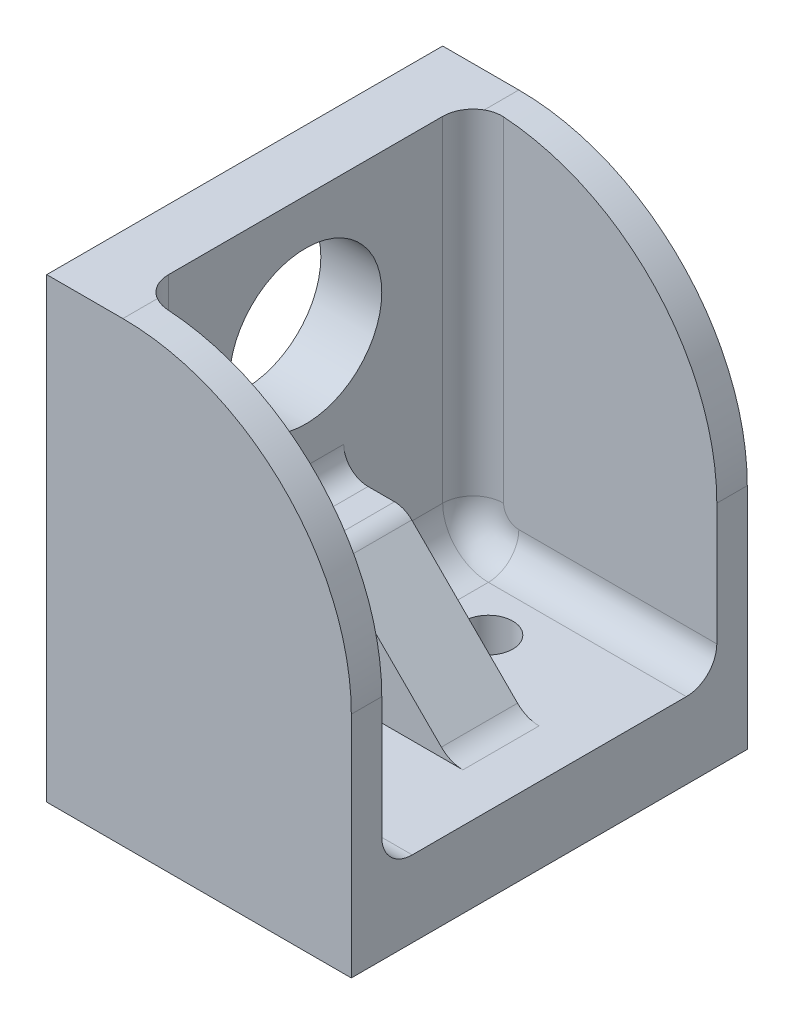
ISO-10303-21;
HEADER;
FILE_DESCRIPTION(('STEP AP214'),'2;1');
FILE_NAME('part.step','',(''),(''),'','','');
FILE_SCHEMA(('AUTOMOTIVE_DESIGN { 1 0 10303 214 1 1 1 1 }'));
ENDSEC;
DATA;
#1=APPLICATION_CONTEXT('core data for automotive mechanical design processes');
#2=APPLICATION_PROTOCOL_DEFINITION('international standard','automotive_design',2000,#1);
#3=PRODUCT_CONTEXT('',#1,'mechanical');
#4=PRODUCT('Part','Part','',(#3));
#5=PRODUCT_RELATED_PRODUCT_CATEGORY('part','',(#4));
#6=PRODUCT_DEFINITION_FORMATION('','',#4);
#7=PRODUCT_DEFINITION_CONTEXT('part definition',#1,'design');
#8=PRODUCT_DEFINITION('design','',#6,#7);
#9=PRODUCT_DEFINITION_SHAPE('','',#8);
#10=(LENGTH_UNIT() NAMED_UNIT(*) SI_UNIT(.MILLI.,.METRE.));
#11=(NAMED_UNIT(*) PLANE_ANGLE_UNIT() SI_UNIT($,.RADIAN.));
#12=(NAMED_UNIT(*) SI_UNIT($,.STERADIAN.) SOLID_ANGLE_UNIT());
#13=UNCERTAINTY_MEASURE_WITH_UNIT(LENGTH_MEASURE(1.E-05),#10,'distance_accuracy_value','');
#14=(GEOMETRIC_REPRESENTATION_CONTEXT(3) GLOBAL_UNCERTAINTY_ASSIGNED_CONTEXT((#13)) GLOBAL_UNIT_ASSIGNED_CONTEXT((#10,
#11,#12)) REPRESENTATION_CONTEXT('',''));
#15=CARTESIAN_POINT('',(0.,0.,0.));
#16=DIRECTION('',(0.,0.,1.));
#17=DIRECTION('',(1.,0.,0.));
#18=AXIS2_PLACEMENT_3D('',#15,#16,#17);
#19=CARTESIAN_POINT('',(0.,5.,0.));
#20=DIRECTION('',(0.,1.,0.));
#21=DIRECTION('',(0.,0.,1.));
#22=AXIS2_PLACEMENT_3D('',#19,#20,#21);
#23=PLANE('',#22);
#24=CARTESIAN_POINT('',(10.,5.,6.));
#25=DIRECTION('',(0.,1.,0.));
#26=DIRECTION('',(0.,0.,1.));
#27=AXIS2_PLACEMENT_3D('',#24,#25,#26);
#28=CIRCLE('',#27,1.6);
#29=CARTESIAN_POINT('',(10.,5.,7.6));
#30=VERTEX_POINT('',#29);
#31=EDGE_CURVE('E571',#30,#30,#28,.T.);
#32=ORIENTED_EDGE('',*,*,#31,.F.);
#33=EDGE_LOOP('',(#32));
#34=FACE_BOUND('',#33,.T.);
#35=CARTESIAN_POINT('',(10.,5.,-6.));
#36=DIRECTION('',(0.,1.,0.));
#37=DIRECTION('',(0.,0.,1.));
#38=AXIS2_PLACEMENT_3D('',#35,#36,#37);
#39=CIRCLE('',#38,1.6);
#40=CARTESIAN_POINT('',(10.,5.,-4.4));
#41=VERTEX_POINT('',#40);
#42=EDGE_CURVE('E568',#41,#41,#39,.T.);
#43=ORIENTED_EDGE('',*,*,#42,.F.);
#44=EDGE_LOOP('',(#43));
#45=FACE_BOUND('',#44,.T.);
#46=DIRECTION('',(0.,0.,-1.));
#47=VECTOR('',#46,1.);
#48=CARTESIAN_POINT('',(7.,5.,13.));
#49=LINE('',#48,#47);
#50=CARTESIAN_POINT('',(7.,5.,2.5));
#51=VERTEX_POINT('',#50);
#52=CARTESIAN_POINT('',(7.,5.,9.));
#53=VERTEX_POINT('',#52);
#54=EDGE_CURVE('E281',#51,#53,#49,.F.);
#55=ORIENTED_EDGE('',*,*,#54,.T.);
#56=DIRECTION('',(-1.,0.,0.));
#57=VECTOR('',#56,1.);
#58=CARTESIAN_POINT('',(0.,5.,9.));
#59=LINE('',#58,#57);
#60=CARTESIAN_POINT('',(20.,5.,9.));
#61=VERTEX_POINT('',#60);
#62=EDGE_CURVE('E334',#53,#61,#59,.F.);
#63=ORIENTED_EDGE('',*,*,#62,.T.);
#64=DIRECTION('',(0.,0.,-1.));
#65=VECTOR('',#64,1.);
#66=CARTESIAN_POINT('',(20.,5.,13.));
#67=LINE('',#66,#65);
#68=CARTESIAN_POINT('',(20.,5.,-8.99999999999999));
#69=VERTEX_POINT('',#68);
#70=EDGE_CURVE('E575',#61,#69,#67,.T.);
#71=ORIENTED_EDGE('',*,*,#70,.T.);
#72=DIRECTION('',(1.,0.,0.));
#73=VECTOR('',#72,1.);
#74=CARTESIAN_POINT('',(0.,5.,-9.));
#75=LINE('',#74,#73);
#76=CARTESIAN_POINT('',(7.,5.,-9.));
#77=VERTEX_POINT('',#76);
#78=EDGE_CURVE('E331',#69,#77,#75,.F.);
#79=ORIENTED_EDGE('',*,*,#78,.T.);
#80=DIRECTION('',(0.,0.,-1.));
#81=VECTOR('',#80,1.);
#82=CARTESIAN_POINT('',(7.,5.,-2.5));
#83=LINE('',#82,#81);
#84=CARTESIAN_POINT('',(7.,5.,-2.5));
#85=VERTEX_POINT('',#84);
#86=EDGE_CURVE('E285',#77,#85,#83,.F.);
#87=ORIENTED_EDGE('',*,*,#86,.T.);
#88=DIRECTION('',(-1.,0.,0.));
#89=VECTOR('',#88,1.);
#90=CARTESIAN_POINT('',(4.,5.,-2.5));
#91=LINE('',#90,#89);
#92=CARTESIAN_POINT('',(16.8284271247461,5.,-2.5));
#93=VERTEX_POINT('',#92);
#94=EDGE_CURVE('E639',#93,#85,#91,.T.);
#95=ORIENTED_EDGE('',*,*,#94,.F.);
#96=DIRECTION('',(0.,0.,1.));
#97=VECTOR('',#96,1.);
#98=CARTESIAN_POINT('',(16.8284271247461,5.,2.5));
#99=LINE('',#98,#97);
#100=CARTESIAN_POINT('',(16.8284271247461,5.,2.5));
#101=VERTEX_POINT('',#100);
#102=EDGE_CURVE('E327',#93,#101,#99,.T.);
#103=ORIENTED_EDGE('',*,*,#102,.T.);
#104=DIRECTION('',(1.,0.,0.));
#105=VECTOR('',#104,1.);
#106=CARTESIAN_POINT('',(4.,5.,2.5));
#107=LINE('',#106,#105);
#108=EDGE_CURVE('E643',#51,#101,#107,.T.);
#109=ORIENTED_EDGE('',*,*,#108,.F.);
#110=EDGE_LOOP('',(#55,#63,#71,#79,#87,#95,#103,#109));
#111=FACE_BOUND('',#110,.T.);
#112=ADVANCED_FACE('F53',(#34,#45,#111),#23,.T.);
#113=CARTESIAN_POINT('',(4.,0.,0.));
#114=DIRECTION('',(1.,0.,0.));
#115=DIRECTION('',(0.,0.,-1.));
#116=AXIS2_PLACEMENT_3D('',#113,#114,#115);
#117=PLANE('',#116);
#118=CARTESIAN_POINT('',(4.,22.,0.));
#119=DIRECTION('',(1.,0.,0.));
#120=DIRECTION('',(0.,0.,-1.));
#121=AXIS2_PLACEMENT_3D('',#118,#119,#120);
#122=CIRCLE('',#121,5.);
#123=CARTESIAN_POINT('',(4.,22.,-5.));
#124=VERTEX_POINT('',#123);
#125=EDGE_CURVE('E554',#124,#124,#122,.T.);
#126=ORIENTED_EDGE('',*,*,#125,.F.);
#127=EDGE_LOOP('',(#126));
#128=FACE_BOUND('',#127,.T.);
#129=DIRECTION('',(0.,-1.,0.));
#130=VECTOR('',#129,1.);
#131=CARTESIAN_POINT('',(4.,13.,2.5));
#132=LINE('',#131,#130);
#133=CARTESIAN_POINT('',(4.,14.6,2.5));
#134=VERTEX_POINT('',#133);
#135=CARTESIAN_POINT('',(4.,8.,2.5));
#136=VERTEX_POINT('',#135);
#137=EDGE_CURVE('E544',#134,#136,#132,.T.);
#138=ORIENTED_EDGE('',*,*,#137,.F.);
#139=DIRECTION('',(0.,0.,1.));
#140=VECTOR('',#139,1.);
#141=CARTESIAN_POINT('',(4.,14.6,-2.5));
#142=LINE('',#141,#140);
#143=CARTESIAN_POINT('',(4.,14.6,-2.5));
#144=VERTEX_POINT('',#143);
#145=EDGE_CURVE('E527',#134,#144,#142,.F.);
#146=ORIENTED_EDGE('',*,*,#145,.T.);
#147=DIRECTION('',(0.,-1.,0.));
#148=VECTOR('',#147,1.);
#149=CARTESIAN_POINT('',(4.,13.,-2.5));
#150=LINE('',#149,#148);
#151=CARTESIAN_POINT('',(4.,8.,-2.5));
#152=VERTEX_POINT('',#151);
#153=EDGE_CURVE('E550',#144,#152,#150,.T.);
#154=ORIENTED_EDGE('',*,*,#153,.T.);
#155=DIRECTION('',(0.,0.,-1.));
#156=VECTOR('',#155,1.);
#157=CARTESIAN_POINT('',(4.,8.,-13.));
#158=LINE('',#157,#156);
#159=CARTESIAN_POINT('',(4.,8.,-9.));
#160=VERTEX_POINT('',#159);
#161=EDGE_CURVE('E277',#152,#160,#158,.T.);
#162=ORIENTED_EDGE('',*,*,#161,.T.);
#163=DIRECTION('',(0.,-1.,0.));
#164=VECTOR('',#163,1.);
#165=CARTESIAN_POINT('',(4.,0.,-9.));
#166=LINE('',#165,#164);
#167=CARTESIAN_POINT('',(4.,30.,-9.));
#168=VERTEX_POINT('',#167);
#169=EDGE_CURVE('E357',#160,#168,#166,.F.);
#170=ORIENTED_EDGE('',*,*,#169,.T.);
#171=DIRECTION('',(0.,0.,1.));
#172=VECTOR('',#171,1.);
#173=CARTESIAN_POINT('',(4.,30.,-13.));
#174=LINE('',#173,#172);
#175=CARTESIAN_POINT('',(4.,30.,8.99999999999999));
#176=VERTEX_POINT('',#175);
#177=EDGE_CURVE('E559',#168,#176,#174,.T.);
#178=ORIENTED_EDGE('',*,*,#177,.T.);
#179=DIRECTION('',(0.,-1.,0.));
#180=VECTOR('',#179,1.);
#181=CARTESIAN_POINT('',(4.,0.,9.));
#182=LINE('',#181,#180);
#183=CARTESIAN_POINT('',(4.,8.,9.));
#184=VERTEX_POINT('',#183);
#185=EDGE_CURVE('E360',#176,#184,#182,.T.);
#186=ORIENTED_EDGE('',*,*,#185,.T.);
#187=DIRECTION('',(0.,0.,-1.));
#188=VECTOR('',#187,1.);
#189=CARTESIAN_POINT('',(4.,8.,2.5));
#190=LINE('',#189,#188);
#191=EDGE_CURVE('E274',#184,#136,#190,.T.);
#192=ORIENTED_EDGE('',*,*,#191,.T.);
#193=EDGE_LOOP('',(#138,#146,#154,#162,#170,#178,#186,#192));
#194=FACE_BOUND('',#193,.T.);
#195=ADVANCED_FACE('F439',(#128,#194),#117,.T.);
#196=CARTESIAN_POINT('',(7.,8.,0.));
#197=DIRECTION('',(0.,0.,1.));
#198=DIRECTION('',(1.,0.,0.));
#199=AXIS2_PLACEMENT_3D('',#196,#197,#198);
#200=CYLINDRICAL_SURFACE('',#199,3.);
#201=ORIENTED_EDGE('',*,*,#86,.F.);
#202=CARTESIAN_POINT('',(7.,8.,-9.));
#203=DIRECTION('',(0.,0.,-1.));
#204=DIRECTION('',(-1.,0.,0.));
#205=AXIS2_PLACEMENT_3D('',#202,#203,#204);
#206=CIRCLE('',#205,3.);
#207=EDGE_CURVE('E350',#77,#160,#206,.T.);
#208=ORIENTED_EDGE('',*,*,#207,.T.);
#209=ORIENTED_EDGE('',*,*,#161,.F.);
#210=CARTESIAN_POINT('',(7.,8.,-2.5));
#211=DIRECTION('',(0.,0.,1.));
#212=DIRECTION('',(1.,0.,0.));
#213=AXIS2_PLACEMENT_3D('',#210,#211,#212);
#214=CIRCLE('',#213,3.);
#215=EDGE_CURVE('E288',#85,#152,#214,.F.);
#216=ORIENTED_EDGE('',*,*,#215,.F.);
#217=EDGE_LOOP('',(#201,#208,#209,#216));
#218=FACE_BOUND('',#217,.T.);
#219=ADVANCED_FACE('F444',(#218),#200,.F.);
#220=CARTESIAN_POINT('',(7.,8.,0.));
#221=DIRECTION('',(0.,0.,1.));
#222=DIRECTION('',(1.,0.,0.));
#223=AXIS2_PLACEMENT_3D('',#220,#221,#222);
#224=CYLINDRICAL_SURFACE('',#223,3.);
#225=ORIENTED_EDGE('',*,*,#191,.F.);
#226=CARTESIAN_POINT('',(7.,8.,9.));
#227=DIRECTION('',(0.,0.,1.));
#228=DIRECTION('',(1.,0.,0.));
#229=AXIS2_PLACEMENT_3D('',#226,#227,#228);
#230=CIRCLE('',#229,3.);
#231=EDGE_CURVE('E337',#184,#53,#230,.T.);
#232=ORIENTED_EDGE('',*,*,#231,.T.);
#233=ORIENTED_EDGE('',*,*,#54,.F.);
#234=CARTESIAN_POINT('',(7.,8.,2.5));
#235=DIRECTION('',(0.,0.,-1.));
#236=DIRECTION('',(-1.,0.,0.));
#237=AXIS2_PLACEMENT_3D('',#234,#235,#236);
#238=CIRCLE('',#237,3.);
#239=EDGE_CURVE('E291',#136,#51,#238,.F.);
#240=ORIENTED_EDGE('',*,*,#239,.F.);
#241=EDGE_LOOP('',(#225,#232,#233,#240));
#242=FACE_BOUND('',#241,.T.);
#243=ADVANCED_FACE('F400',(#242),#224,.F.);
#244=CARTESIAN_POINT('',(0.,30.,-13.));
#245=DIRECTION('',(0.,1.,0.));
#246=DIRECTION('',(0.,0.,1.));
#247=AXIS2_PLACEMENT_3D('',#244,#245,#246);
#248=PLANE('',#247);
#249=DIRECTION('',(-1.,0.,0.));
#250=VECTOR('',#249,1.);
#251=CARTESIAN_POINT('',(0.,30.,13.));
#252=LINE('',#251,#250);
#253=CARTESIAN_POINT('',(5.,30.,13.));
#254=VERTEX_POINT('',#253);
#255=CARTESIAN_POINT('',(0.,30.,13.));
#256=VERTEX_POINT('',#255);
#257=EDGE_CURVE('E209',#254,#256,#252,.T.);
#258=ORIENTED_EDGE('',*,*,#257,.F.);
#259=DIRECTION('',(0.,0.,-1.));
#260=VECTOR('',#259,1.);
#261=CARTESIAN_POINT('',(5.,30.,-13.));
#262=LINE('',#261,#260);
#263=CARTESIAN_POINT('',(5.,30.,10.7320508075689));
#264=VERTEX_POINT('',#263);
#265=EDGE_CURVE('E297',#254,#264,#262,.T.);
#266=ORIENTED_EDGE('',*,*,#265,.T.);
#267=CARTESIAN_POINT('',(6.,30.,9.));
#268=DIRECTION('',(0.,1.,0.));
#269=DIRECTION('',(0.,0.,1.));
#270=AXIS2_PLACEMENT_3D('',#267,#268,#269);
#271=CIRCLE('',#270,2.);
#272=EDGE_CURVE('E386',#264,#176,#271,.F.);
#273=ORIENTED_EDGE('',*,*,#272,.T.);
#274=ORIENTED_EDGE('',*,*,#177,.F.);
#275=CARTESIAN_POINT('',(6.,30.,-9.));
#276=DIRECTION('',(0.,1.,0.));
#277=DIRECTION('',(0.,0.,1.));
#278=AXIS2_PLACEMENT_3D('',#275,#276,#277);
#279=CIRCLE('',#278,2.);
#280=CARTESIAN_POINT('',(5.,30.,-10.7320508075689));
#281=VERTEX_POINT('',#280);
#282=EDGE_CURVE('E417',#168,#281,#279,.F.);
#283=ORIENTED_EDGE('',*,*,#282,.T.);
#284=DIRECTION('',(0.,0.,-1.));
#285=VECTOR('',#284,1.);
#286=CARTESIAN_POINT('',(5.,30.,-13.));
#287=LINE('',#286,#285);
#288=CARTESIAN_POINT('',(5.,30.,-13.));
#289=VERTEX_POINT('',#288);
#290=EDGE_CURVE('E294',#281,#289,#287,.T.);
#291=ORIENTED_EDGE('',*,*,#290,.T.);
#292=DIRECTION('',(-1.,0.,0.));
#293=VECTOR('',#292,1.);
#294=CARTESIAN_POINT('',(0.,30.,-13.));
#295=LINE('',#294,#293);
#296=CARTESIAN_POINT('',(0.,30.,-13.));
#297=VERTEX_POINT('',#296);
#298=EDGE_CURVE('E229',#289,#297,#295,.T.);
#299=ORIENTED_EDGE('',*,*,#298,.T.);
#300=DIRECTION('',(0.,0.,1.));
#301=VECTOR('',#300,1.);
#302=CARTESIAN_POINT('',(0.,30.,-13.));
#303=LINE('',#302,#301);
#304=EDGE_CURVE('E225',#297,#256,#303,.T.);
#305=ORIENTED_EDGE('',*,*,#304,.T.);
#306=EDGE_LOOP('',(#258,#266,#273,#274,#283,#291,#299,#305));
#307=FACE_BOUND('',#306,.T.);
#308=ADVANCED_FACE('F226',(#307),#248,.T.);
#309=CARTESIAN_POINT('',(20.,0.,-13.));
#310=DIRECTION('',(1.,0.,0.));
#311=DIRECTION('',(0.,0.,-1.));
#312=AXIS2_PLACEMENT_3D('',#309,#310,#311);
#313=PLANE('',#312);
#314=DIRECTION('',(0.,-1.,0.));
#315=VECTOR('',#314,1.);
#316=CARTESIAN_POINT('',(20.,46.1245154965971,11.));
#317=LINE('',#316,#315);
#318=CARTESIAN_POINT('',(20.,15.,11.));
#319=VERTEX_POINT('',#318);
#320=CARTESIAN_POINT('',(20.,7.,11.));
#321=VERTEX_POINT('',#320);
#322=EDGE_CURVE('E652',#319,#321,#317,.T.);
#323=ORIENTED_EDGE('',*,*,#322,.F.);
#324=DIRECTION('',(0.,0.,-1.));
#325=VECTOR('',#324,1.);
#326=CARTESIAN_POINT('',(20.,15.,-13.));
#327=LINE('',#326,#325);
#328=CARTESIAN_POINT('',(20.,15.,13.));
#329=VERTEX_POINT('',#328);
#330=EDGE_CURVE('E306',#319,#329,#327,.F.);
#331=ORIENTED_EDGE('',*,*,#330,.T.);
#332=DIRECTION('',(0.,1.,0.));
#333=VECTOR('',#332,1.);
#334=CARTESIAN_POINT('',(20.,0.,13.));
#335=LINE('',#334,#333);
#336=CARTESIAN_POINT('',(20.,0.,13.));
#337=VERTEX_POINT('',#336);
#338=EDGE_CURVE('E245',#337,#329,#335,.T.);
#339=ORIENTED_EDGE('',*,*,#338,.F.);
#340=DIRECTION('',(0.,0.,1.));
#341=VECTOR('',#340,1.);
#342=CARTESIAN_POINT('',(20.,0.,-13.));
#343=LINE('',#342,#341);
#344=CARTESIAN_POINT('',(20.,0.,-13.));
#345=VERTEX_POINT('',#344);
#346=EDGE_CURVE('E263',#345,#337,#343,.T.);
#347=ORIENTED_EDGE('',*,*,#346,.F.);
#348=DIRECTION('',(0.,1.,0.));
#349=VECTOR('',#348,1.);
#350=CARTESIAN_POINT('',(20.,0.,-13.));
#351=LINE('',#350,#349);
#352=CARTESIAN_POINT('',(20.,15.,-13.));
#353=VERTEX_POINT('',#352);
#354=EDGE_CURVE('E235',#345,#353,#351,.T.);
#355=ORIENTED_EDGE('',*,*,#354,.T.);
#356=DIRECTION('',(0.,0.,-1.));
#357=VECTOR('',#356,1.);
#358=CARTESIAN_POINT('',(20.,15.,-13.));
#359=LINE('',#358,#357);
#360=CARTESIAN_POINT('',(20.,15.,-11.));
#361=VERTEX_POINT('',#360);
#362=EDGE_CURVE('E303',#353,#361,#359,.F.);
#363=ORIENTED_EDGE('',*,*,#362,.T.);
#364=DIRECTION('',(0.,-1.,0.));
#365=VECTOR('',#364,1.);
#366=CARTESIAN_POINT('',(20.,46.1245154965971,-11.));
#367=LINE('',#366,#365);
#368=CARTESIAN_POINT('',(20.,7.,-11.));
#369=VERTEX_POINT('',#368);
#370=EDGE_CURVE('E647',#361,#369,#367,.T.);
#371=ORIENTED_EDGE('',*,*,#370,.T.);
#372=CARTESIAN_POINT('',(20.,7.,-9.));
#373=DIRECTION('',(1.,0.,0.));
#374=DIRECTION('',(0.,0.,-1.));
#375=AXIS2_PLACEMENT_3D('',#372,#373,#374);
#376=CIRCLE('',#375,2.);
#377=EDGE_CURVE('E366',#369,#69,#376,.F.);
#378=ORIENTED_EDGE('',*,*,#377,.T.);
#379=ORIENTED_EDGE('',*,*,#70,.F.);
#380=CARTESIAN_POINT('',(20.,7.,9.));
#381=DIRECTION('',(1.,0.,0.));
#382=DIRECTION('',(0.,0.,-1.));
#383=AXIS2_PLACEMENT_3D('',#380,#381,#382);
#384=CIRCLE('',#383,2.);
#385=EDGE_CURVE('E363',#61,#321,#384,.F.);
#386=ORIENTED_EDGE('',*,*,#385,.T.);
#387=EDGE_LOOP('',(#323,#331,#339,#347,#355,#363,#371,#378,#379,#386));
#388=FACE_BOUND('',#387,.T.);
#389=ADVANCED_FACE('F470',(#388),#313,.T.);
#390=CARTESIAN_POINT('',(0.,0.,-13.));
#391=DIRECTION('',(0.,-1.,0.));
#392=DIRECTION('',(0.,0.,-1.));
#393=AXIS2_PLACEMENT_3D('',#390,#391,#392);
#394=PLANE('',#393);
#395=CARTESIAN_POINT('',(10.,0.,-6.));
#396=DIRECTION('',(0.,1.,0.));
#397=DIRECTION('',(0.,0.,1.));
#398=AXIS2_PLACEMENT_3D('',#395,#396,#397);
#399=CIRCLE('',#398,1.6);
#400=CARTESIAN_POINT('',(10.,0.,-4.4));
#401=VERTEX_POINT('',#400);
#402=EDGE_CURVE('E580',#401,#401,#399,.T.);
#403=ORIENTED_EDGE('',*,*,#402,.T.);
#404=EDGE_LOOP('',(#403));
#405=FACE_BOUND('',#404,.T.);
#406=CARTESIAN_POINT('',(10.,0.,6.));
#407=DIRECTION('',(0.,1.,0.));
#408=DIRECTION('',(0.,0.,-1.));
#409=AXIS2_PLACEMENT_3D('',#406,#407,#408);
#410=CIRCLE('',#409,1.6);
#411=CARTESIAN_POINT('',(10.,0.,4.4));
#412=VERTEX_POINT('',#411);
#413=EDGE_CURVE('E579',#412,#412,#410,.T.);
#414=ORIENTED_EDGE('',*,*,#413,.T.);
#415=EDGE_LOOP('',(#414));
#416=FACE_BOUND('',#415,.T.);
#417=ORIENTED_EDGE('',*,*,#346,.T.);
#418=DIRECTION('',(1.,0.,0.));
#419=VECTOR('',#418,1.);
#420=CARTESIAN_POINT('',(0.,0.,13.));
#421=LINE('',#420,#419);
#422=CARTESIAN_POINT('',(0.,0.,13.));
#423=VERTEX_POINT('',#422);
#424=EDGE_CURVE('E239',#423,#337,#421,.T.);
#425=ORIENTED_EDGE('',*,*,#424,.F.);
#426=DIRECTION('',(0.,0.,1.));
#427=VECTOR('',#426,1.);
#428=CARTESIAN_POINT('',(0.,0.,-13.));
#429=LINE('',#428,#427);
#430=CARTESIAN_POINT('',(0.,0.,-13.));
#431=VERTEX_POINT('',#430);
#432=EDGE_CURVE('E234',#431,#423,#429,.T.);
#433=ORIENTED_EDGE('',*,*,#432,.F.);
#434=DIRECTION('',(1.,0.,0.));
#435=VECTOR('',#434,1.);
#436=CARTESIAN_POINT('',(0.,0.,-13.));
#437=LINE('',#436,#435);
#438=EDGE_CURVE('E256',#431,#345,#437,.T.);
#439=ORIENTED_EDGE('',*,*,#438,.T.);
#440=EDGE_LOOP('',(#417,#425,#433,#439));
#441=FACE_BOUND('',#440,.T.);
#442=ADVANCED_FACE('F473',(#405,#416,#441),#394,.T.);
#443=CARTESIAN_POINT('',(0.,30.,-13.));
#444=DIRECTION('',(-1.,0.,0.));
#445=DIRECTION('',(0.,0.,1.));
#446=AXIS2_PLACEMENT_3D('',#443,#444,#445);
#447=PLANE('',#446);
#448=CARTESIAN_POINT('',(0.,22.,0.));
#449=DIRECTION('',(1.,0.,0.));
#450=DIRECTION('',(0.,0.,-1.));
#451=AXIS2_PLACEMENT_3D('',#448,#449,#450);
#452=CIRCLE('',#451,5.);
#453=CARTESIAN_POINT('',(0.,22.,-5.));
#454=VERTEX_POINT('',#453);
#455=EDGE_CURVE('E222',#454,#454,#452,.T.);
#456=ORIENTED_EDGE('',*,*,#455,.T.);
#457=EDGE_LOOP('',(#456));
#458=FACE_BOUND('',#457,.T.);
#459=ORIENTED_EDGE('',*,*,#432,.T.);
#460=DIRECTION('',(0.,-1.,0.));
#461=VECTOR('',#460,1.);
#462=CARTESIAN_POINT('',(0.,30.,13.));
#463=LINE('',#462,#461);
#464=EDGE_CURVE('E215',#256,#423,#463,.T.);
#465=ORIENTED_EDGE('',*,*,#464,.F.);
#466=ORIENTED_EDGE('',*,*,#304,.F.);
#467=DIRECTION('',(0.,-1.,0.));
#468=VECTOR('',#467,1.);
#469=CARTESIAN_POINT('',(0.,30.,-13.));
#470=LINE('',#469,#468);
#471=EDGE_CURVE('E253',#297,#431,#470,.T.);
#472=ORIENTED_EDGE('',*,*,#471,.T.);
#473=EDGE_LOOP('',(#459,#465,#466,#472));
#474=FACE_BOUND('',#473,.T.);
#475=ADVANCED_FACE('F237',(#458,#474),#447,.T.);
#476=CARTESIAN_POINT('',(0.,0.,-13.));
#477=DIRECTION('',(0.,0.,-1.));
#478=DIRECTION('',(-1.,0.,0.));
#479=AXIS2_PLACEMENT_3D('',#476,#477,#478);
#480=PLANE('',#479);
#481=ORIENTED_EDGE('',*,*,#298,.F.);
#482=CARTESIAN_POINT('',(5.,15.,-13.));
#483=DIRECTION('',(0.,0.,-1.));
#484=DIRECTION('',(-1.,0.,0.));
#485=AXIS2_PLACEMENT_3D('',#482,#483,#484);
#486=CIRCLE('',#485,15.);
#487=EDGE_CURVE('E310',#289,#353,#486,.T.);
#488=ORIENTED_EDGE('',*,*,#487,.T.);
#489=ORIENTED_EDGE('',*,*,#354,.F.);
#490=ORIENTED_EDGE('',*,*,#438,.F.);
#491=ORIENTED_EDGE('',*,*,#471,.F.);
#492=EDGE_LOOP('',(#481,#488,#489,#490,#491));
#493=FACE_BOUND('',#492,.T.);
#494=ADVANCED_FACE('F466',(#493),#480,.T.);
#495=CARTESIAN_POINT('',(0.,0.,13.));
#496=DIRECTION('',(0.,0.,-1.));
#497=DIRECTION('',(-1.,0.,0.));
#498=AXIS2_PLACEMENT_3D('',#495,#496,#497);
#499=PLANE('',#498);
#500=ORIENTED_EDGE('',*,*,#338,.T.);
#501=CARTESIAN_POINT('',(5.,15.,13.));
#502=DIRECTION('',(0.,0.,-1.));
#503=DIRECTION('',(-1.,0.,0.));
#504=AXIS2_PLACEMENT_3D('',#501,#502,#503);
#505=CIRCLE('',#504,15.);
#506=EDGE_CURVE('E218',#329,#254,#505,.F.);
#507=ORIENTED_EDGE('',*,*,#506,.T.);
#508=ORIENTED_EDGE('',*,*,#257,.T.);
#509=ORIENTED_EDGE('',*,*,#464,.T.);
#510=ORIENTED_EDGE('',*,*,#424,.T.);
#511=EDGE_LOOP('',(#500,#507,#508,#509,#510));
#512=FACE_BOUND('',#511,.T.);
#513=ADVANCED_FACE('F212',(#512),#499,.F.);
#514=CARTESIAN_POINT('',(0.,22.,0.));
#515=DIRECTION('',(1.,0.,0.));
#516=DIRECTION('',(0.,0.,-1.));
#517=AXIS2_PLACEMENT_3D('',#514,#515,#516);
#518=CYLINDRICAL_SURFACE('',#517,5.);
#519=ORIENTED_EDGE('',*,*,#455,.F.);
#520=EDGE_LOOP('',(#519));
#521=FACE_BOUND('',#520,.T.);
#522=ORIENTED_EDGE('',*,*,#125,.T.);
#523=EDGE_LOOP('',(#522));
#524=FACE_BOUND('',#523,.T.);
#525=ADVANCED_FACE('F459',(#521,#524),#518,.F.);
#526=CARTESIAN_POINT('',(10.,0.,6.));
#527=DIRECTION('',(0.,1.,0.));
#528=DIRECTION('',(0.,0.,1.));
#529=AXIS2_PLACEMENT_3D('',#526,#527,#528);
#530=CYLINDRICAL_SURFACE('',#529,1.6);
#531=ORIENTED_EDGE('',*,*,#413,.F.);
#532=EDGE_LOOP('',(#531));
#533=FACE_BOUND('',#532,.T.);
#534=ORIENTED_EDGE('',*,*,#31,.T.);
#535=EDGE_LOOP('',(#534));
#536=FACE_BOUND('',#535,.T.);
#537=ADVANCED_FACE('F455',(#533,#536),#530,.F.);
#538=CARTESIAN_POINT('',(10.,0.,-6.));
#539=DIRECTION('',(0.,1.,0.));
#540=DIRECTION('',(0.,0.,1.));
#541=AXIS2_PLACEMENT_3D('',#538,#539,#540);
#542=CYLINDRICAL_SURFACE('',#541,1.6);
#543=ORIENTED_EDGE('',*,*,#402,.F.);
#544=EDGE_LOOP('',(#543));
#545=FACE_BOUND('',#544,.T.);
#546=ORIENTED_EDGE('',*,*,#42,.T.);
#547=EDGE_LOOP('',(#546));
#548=FACE_BOUND('',#547,.T.);
#549=ADVANCED_FACE('F451',(#545,#548),#542,.F.);
#550=CARTESIAN_POINT('',(4.,13.,2.5));
#551=DIRECTION('',(0.,0.,-1.));
#552=DIRECTION('',(-1.,0.,0.));
#553=AXIS2_PLACEMENT_3D('',#550,#551,#552);
#554=PLANE('',#553);
#555=DIRECTION('',(-0.707106781186551,0.707106781186544,0.));
#556=VECTOR('',#555,1.);
#557=CARTESIAN_POINT('',(7.99999999999983,13.,2.5));
#558=LINE('',#557,#556);
#559=CARTESIAN_POINT('',(15.414213562373,5.5857864376269,2.5));
#560=VERTEX_POINT('',#559);
#561=CARTESIAN_POINT('',(8.46862915010135,12.5313708498985,2.5));
#562=VERTEX_POINT('',#561);
#563=EDGE_CURVE('E271',#560,#562,#558,.T.);
#564=ORIENTED_EDGE('',*,*,#563,.T.);
#565=CARTESIAN_POINT('',(7.33725830020288,11.4,2.5));
#566=DIRECTION('',(0.,0.,-1.));
#567=DIRECTION('',(-1.,0.,0.));
#568=AXIS2_PLACEMENT_3D('',#565,#566,#567);
#569=CIRCLE('',#568,1.6);
#570=CARTESIAN_POINT('',(7.33725830020288,13.,2.5));
#571=VERTEX_POINT('',#570);
#572=EDGE_CURVE('E535',#562,#571,#569,.F.);
#573=ORIENTED_EDGE('',*,*,#572,.T.);
#574=DIRECTION('',(1.,0.,0.));
#575=VECTOR('',#574,1.);
#576=CARTESIAN_POINT('',(4.,13.,2.5));
#577=LINE('',#576,#575);
#578=CARTESIAN_POINT('',(5.6,13.,2.5));
#579=VERTEX_POINT('',#578);
#580=EDGE_CURVE('E546',#579,#571,#577,.T.);
#581=ORIENTED_EDGE('',*,*,#580,.F.);
#582=CARTESIAN_POINT('',(5.6,14.6,2.5));
#583=DIRECTION('',(0.,0.,-1.));
#584=DIRECTION('',(-1.,0.,0.));
#585=AXIS2_PLACEMENT_3D('',#582,#583,#584);
#586=CIRCLE('',#585,1.6);
#587=EDGE_CURVE('E62',#579,#134,#586,.T.);
#588=ORIENTED_EDGE('',*,*,#587,.T.);
#589=ORIENTED_EDGE('',*,*,#137,.T.);
#590=ORIENTED_EDGE('',*,*,#239,.T.);
#591=ORIENTED_EDGE('',*,*,#108,.T.);
#592=CARTESIAN_POINT('',(16.8284271247461,7.,2.5));
#593=DIRECTION('',(0.,0.,-1.));
#594=DIRECTION('',(-1.,0.,0.));
#595=AXIS2_PLACEMENT_3D('',#592,#593,#594);
#596=CIRCLE('',#595,2.);
#597=EDGE_CURVE('E369',#101,#560,#596,.T.);
#598=ORIENTED_EDGE('',*,*,#597,.T.);
#599=EDGE_LOOP('',(#564,#573,#581,#588,#589,#590,#591,#598));
#600=FACE_BOUND('',#599,.T.);
#601=ADVANCED_FACE('F454',(#600),#554,.F.);
#602=CARTESIAN_POINT('',(4.,13.,-2.5));
#603=DIRECTION('',(0.,0.,1.));
#604=DIRECTION('',(1.,0.,0.));
#605=AXIS2_PLACEMENT_3D('',#602,#603,#604);
#606=PLANE('',#605);
#607=DIRECTION('',(-1.,0.,0.));
#608=VECTOR('',#607,1.);
#609=CARTESIAN_POINT('',(4.,13.,-2.5));
#610=LINE('',#609,#608);
#611=CARTESIAN_POINT('',(7.33725830020288,13.,-2.5));
#612=VERTEX_POINT('',#611);
#613=CARTESIAN_POINT('',(5.6,13.,-2.5));
#614=VERTEX_POINT('',#613);
#615=EDGE_CURVE('E562',#612,#614,#610,.T.);
#616=ORIENTED_EDGE('',*,*,#615,.F.);
#617=CARTESIAN_POINT('',(7.33725830020288,11.4,-2.5));
#618=DIRECTION('',(0.,0.,1.));
#619=DIRECTION('',(1.,0.,0.));
#620=AXIS2_PLACEMENT_3D('',#617,#618,#619);
#621=CIRCLE('',#620,1.6);
#622=CARTESIAN_POINT('',(8.46862915010135,12.5313708498985,-2.5));
#623=VERTEX_POINT('',#622);
#624=EDGE_CURVE('E77',#612,#623,#621,.F.);
#625=ORIENTED_EDGE('',*,*,#624,.T.);
#626=DIRECTION('',(0.707106781186551,-0.707106781186544,0.));
#627=VECTOR('',#626,1.);
#628=CARTESIAN_POINT('',(7.99999999999983,13.,-2.5));
#629=LINE('',#628,#627);
#630=CARTESIAN_POINT('',(15.414213562373,5.5857864376269,-2.5));
#631=VERTEX_POINT('',#630);
#632=EDGE_CURVE('E266',#623,#631,#629,.T.);
#633=ORIENTED_EDGE('',*,*,#632,.T.);
#634=CARTESIAN_POINT('',(16.8284271247461,7.,-2.5));
#635=DIRECTION('',(0.,0.,1.));
#636=DIRECTION('',(1.,0.,0.));
#637=AXIS2_PLACEMENT_3D('',#634,#635,#636);
#638=CIRCLE('',#637,2.);
#639=EDGE_CURVE('E372',#631,#93,#638,.T.);
#640=ORIENTED_EDGE('',*,*,#639,.T.);
#641=ORIENTED_EDGE('',*,*,#94,.T.);
#642=ORIENTED_EDGE('',*,*,#215,.T.);
#643=ORIENTED_EDGE('',*,*,#153,.F.);
#644=CARTESIAN_POINT('',(5.6,14.6,-2.5));
#645=DIRECTION('',(0.,0.,1.));
#646=DIRECTION('',(1.,0.,0.));
#647=AXIS2_PLACEMENT_3D('',#644,#645,#646);
#648=CIRCLE('',#647,1.6);
#649=EDGE_CURVE('E11',#144,#614,#648,.T.);
#650=ORIENTED_EDGE('',*,*,#649,.T.);
#651=EDGE_LOOP('',(#616,#625,#633,#640,#641,#642,#643,#650));
#652=FACE_BOUND('',#651,.T.);
#653=ADVANCED_FACE('F724',(#652),#606,.F.);
#654=CARTESIAN_POINT('',(0.,13.,0.));
#655=DIRECTION('',(0.,1.,0.));
#656=DIRECTION('',(0.,0.,1.));
#657=AXIS2_PLACEMENT_3D('',#654,#655,#656);
#658=PLANE('',#657);
#659=ORIENTED_EDGE('',*,*,#615,.T.);
#660=DIRECTION('',(0.,0.,1.));
#661=VECTOR('',#660,1.);
#662=CARTESIAN_POINT('',(5.6,13.,2.5));
#663=LINE('',#662,#661);
#664=EDGE_CURVE('E523',#614,#579,#663,.T.);
#665=ORIENTED_EDGE('',*,*,#664,.T.);
#666=ORIENTED_EDGE('',*,*,#580,.T.);
#667=DIRECTION('',(0.,0.,-1.));
#668=VECTOR('',#667,1.);
#669=CARTESIAN_POINT('',(7.33725830020288,13.,0.));
#670=LINE('',#669,#668);
#671=EDGE_CURVE('E416',#571,#612,#670,.T.);
#672=ORIENTED_EDGE('',*,*,#671,.T.);
#673=EDGE_LOOP('',(#659,#665,#666,#672));
#674=FACE_BOUND('',#673,.T.);
#675=ADVANCED_FACE('F489',(#674),#658,.T.);
#676=CARTESIAN_POINT('',(7.99999999999983,13.,0.));
#677=DIRECTION('',(0.707106781186544,0.707106781186551,0.));
#678=DIRECTION('',(0.,0.,1.));
#679=AXIS2_PLACEMENT_3D('',#676,#677,#678);
#680=PLANE('',#679);
#681=ORIENTED_EDGE('',*,*,#632,.F.);
#682=DIRECTION('',(0.,0.,-1.));
#683=VECTOR('',#682,1.);
#684=CARTESIAN_POINT('',(8.46862915010135,12.5313708498985,0.));
#685=LINE('',#684,#683);
#686=EDGE_CURVE('E69',#623,#562,#685,.F.);
#687=ORIENTED_EDGE('',*,*,#686,.T.);
#688=ORIENTED_EDGE('',*,*,#563,.F.);
#689=DIRECTION('',(0.,0.,1.));
#690=VECTOR('',#689,1.);
#691=CARTESIAN_POINT('',(15.414213562373,5.5857864376269,-2.5));
#692=LINE('',#691,#690);
#693=EDGE_CURVE('E353',#560,#631,#692,.F.);
#694=ORIENTED_EDGE('',*,*,#693,.T.);
#695=EDGE_LOOP('',(#681,#687,#688,#694));
#696=FACE_BOUND('',#695,.T.);
#697=ADVANCED_FACE('F484',(#696),#680,.T.);
#698=CARTESIAN_POINT('',(20.,46.1245154965971,11.));
#699=DIRECTION('',(0.,0.,1.));
#700=DIRECTION('',(1.,0.,0.));
#701=AXIS2_PLACEMENT_3D('',#698,#699,#700);
#702=PLANE('',#701);
#703=ORIENTED_EDGE('',*,*,#322,.T.);
#704=DIRECTION('',(-1.,0.,0.));
#705=VECTOR('',#704,1.);
#706=CARTESIAN_POINT('',(20.,7.,11.));
#707=LINE('',#706,#705);
#708=CARTESIAN_POINT('',(7.,7.,11.));
#709=VERTEX_POINT('',#708);
#710=EDGE_CURVE('E323',#321,#709,#707,.T.);
#711=ORIENTED_EDGE('',*,*,#710,.T.);
#712=CARTESIAN_POINT('',(7.,8.,11.));
#713=DIRECTION('',(0.,0.,1.));
#714=DIRECTION('',(1.,0.,0.));
#715=AXIS2_PLACEMENT_3D('',#712,#713,#714);
#716=CIRCLE('',#715,1.);
#717=CARTESIAN_POINT('',(6.,8.,11.));
#718=VERTEX_POINT('',#717);
#719=EDGE_CURVE('E320',#709,#718,#716,.F.);
#720=ORIENTED_EDGE('',*,*,#719,.T.);
#721=DIRECTION('',(0.,-1.,0.));
#722=VECTOR('',#721,1.);
#723=CARTESIAN_POINT('',(6.,46.1245154965971,11.));
#724=LINE('',#723,#722);
#725=CARTESIAN_POINT('',(6.,29.9666295470958,11.));
#726=VERTEX_POINT('',#725);
#727=EDGE_CURVE('E317',#718,#726,#724,.F.);
#728=ORIENTED_EDGE('',*,*,#727,.T.);
#729=CARTESIAN_POINT('',(5.,15.,11.));
#730=DIRECTION('',(0.,0.,1.));
#731=DIRECTION('',(1.,0.,0.));
#732=AXIS2_PLACEMENT_3D('',#729,#730,#731);
#733=CIRCLE('',#732,15.);
#734=EDGE_CURVE('E300',#726,#319,#733,.F.);
#735=ORIENTED_EDGE('',*,*,#734,.T.);
#736=EDGE_LOOP('',(#703,#711,#720,#728,#735));
#737=FACE_BOUND('',#736,.T.);
#738=ADVANCED_FACE('F488',(#737),#702,.F.);
#739=CARTESIAN_POINT('',(20.,46.1245154965971,-11.));
#740=DIRECTION('',(0.,0.,-1.));
#741=DIRECTION('',(-1.,0.,0.));
#742=AXIS2_PLACEMENT_3D('',#739,#740,#741);
#743=PLANE('',#742);
#744=CARTESIAN_POINT('',(7.,8.,-11.));
#745=DIRECTION('',(0.,0.,-1.));
#746=DIRECTION('',(-1.,0.,0.));
#747=AXIS2_PLACEMENT_3D('',#744,#745,#746);
#748=CIRCLE('',#747,1.);
#749=CARTESIAN_POINT('',(6.,8.,-11.));
#750=VERTEX_POINT('',#749);
#751=CARTESIAN_POINT('',(7.,7.,-11.));
#752=VERTEX_POINT('',#751);
#753=EDGE_CURVE('E343',#750,#752,#748,.F.);
#754=ORIENTED_EDGE('',*,*,#753,.T.);
#755=DIRECTION('',(1.,0.,0.));
#756=VECTOR('',#755,1.);
#757=CARTESIAN_POINT('',(20.,7.,-11.));
#758=LINE('',#757,#756);
#759=EDGE_CURVE('E346',#752,#369,#758,.T.);
#760=ORIENTED_EDGE('',*,*,#759,.T.);
#761=ORIENTED_EDGE('',*,*,#370,.F.);
#762=CARTESIAN_POINT('',(5.,15.,-11.));
#763=DIRECTION('',(0.,0.,-1.));
#764=DIRECTION('',(-1.,0.,0.));
#765=AXIS2_PLACEMENT_3D('',#762,#763,#764);
#766=CIRCLE('',#765,15.);
#767=CARTESIAN_POINT('',(6.,29.9666295470958,-11.));
#768=VERTEX_POINT('',#767);
#769=EDGE_CURVE('E313',#361,#768,#766,.F.);
#770=ORIENTED_EDGE('',*,*,#769,.T.);
#771=DIRECTION('',(0.,-1.,0.));
#772=VECTOR('',#771,1.);
#773=CARTESIAN_POINT('',(6.,46.1245154965971,-11.));
#774=LINE('',#773,#772);
#775=EDGE_CURVE('E340',#768,#750,#774,.T.);
#776=ORIENTED_EDGE('',*,*,#775,.T.);
#777=EDGE_LOOP('',(#754,#760,#761,#770,#776));
#778=FACE_BOUND('',#777,.T.);
#779=ADVANCED_FACE('F398',(#778),#743,.F.);
#780=CARTESIAN_POINT('',(5.,15.,-13.));
#781=DIRECTION('',(0.,0.,-1.));
#782=DIRECTION('',(-1.,0.,0.));
#783=AXIS2_PLACEMENT_3D('',#780,#781,#782);
#784=CYLINDRICAL_SURFACE('',#783,15.);
#785=ORIENTED_EDGE('',*,*,#506,.F.);
#786=ORIENTED_EDGE('',*,*,#330,.F.);
#787=ORIENTED_EDGE('',*,*,#734,.F.);
#788=CARTESIAN_POINT('',(6.,29.9666295470958,11.));
#789=CARTESIAN_POINT('',(5.94366434248604,29.970396876016,11.0000065594499));
#790=CARTESIAN_POINT('',(5.88730688883966,29.9738397758668,10.997619950083));
#791=CARTESIAN_POINT('',(5.77494255964589,29.9800736038032,10.988095112648));
#792=CARTESIAN_POINT('',(5.71893578721177,29.9828643481548,10.9809555476902));
#793=CARTESIAN_POINT('',(5.60890600180195,29.987735201525,10.9621656485763));
#794=CARTESIAN_POINT('',(5.55486631368777,29.9898294164219,10.9506165537258));
#795=CARTESIAN_POINT('',(5.44793119043668,29.9934058520719,10.9230880274596));
#796=CARTESIAN_POINT('',(5.39503530860777,29.9948883159781,10.9071103605001));
#797=CARTESIAN_POINT('',(5.2838200058891,29.9974307229266,10.8684199886868));
#798=CARTESIAN_POINT('',(5.22571063394679,29.9984086540673,10.8450953949941));
#799=CARTESIAN_POINT('',(5.11120794544144,29.9996994052639,10.7927832581259));
#800=CARTESIAN_POINT('',(5.05484531750764,30.0000037242006,10.7637283189955));
#801=CARTESIAN_POINT('',(5.,30.,10.7320508075689));
#802=B_SPLINE_CURVE_WITH_KNOTS('',3,(#788,#789,#790,#791,#792,#793,#794,#795,#796,#797,#798,
#799,#800,#801),.UNSPECIFIED.,.F.,.F.,(4,2,2,2,2,2,4),(0.,0.169333503777667,0.338714657052667,
0.50442046192345,0.670060340044996,0.857647782408907,1.04758943316186),.UNSPECIFIED.);
#803=EDGE_CURVE('E376',#726,#264,#802,.T.);
#804=ORIENTED_EDGE('',*,*,#803,.T.);
#805=ORIENTED_EDGE('',*,*,#265,.F.);
#806=EDGE_LOOP('',(#785,#786,#787,#804,#805));
#807=FACE_BOUND('',#806,.T.);
#808=ADVANCED_FACE('F392',(#807),#784,.T.);
#809=CARTESIAN_POINT('',(5.,15.,-13.));
#810=DIRECTION('',(0.,0.,-1.));
#811=DIRECTION('',(-1.,0.,0.));
#812=AXIS2_PLACEMENT_3D('',#809,#810,#811);
#813=CYLINDRICAL_SURFACE('',#812,15.);
#814=ORIENTED_EDGE('',*,*,#769,.F.);
#815=ORIENTED_EDGE('',*,*,#362,.F.);
#816=ORIENTED_EDGE('',*,*,#487,.F.);
#817=ORIENTED_EDGE('',*,*,#290,.F.);
#818=CARTESIAN_POINT('',(5.,30.,-10.7320508075689));
#819=CARTESIAN_POINT('',(5.04889390186804,30.0000022509253,-10.7602872137289));
#820=CARTESIAN_POINT('',(5.09898962968654,29.999761051693,-10.7864419705474));
#821=CARTESIAN_POINT('',(5.20122164345521,29.9987367970912,-10.8344306149464));
#822=CARTESIAN_POINT('',(5.25335850255034,29.9979535884821,-10.8562632783175));
#823=CARTESIAN_POINT('',(5.35813230579598,29.995813768265,-10.8950089932808));
#824=CARTESIAN_POINT('',(5.41073384590017,29.9944699686316,-10.9120185217865));
#825=CARTESIAN_POINT('',(5.51712361158873,29.9911779406248,-10.9416174714825));
#826=CARTESIAN_POINT('',(5.57091135587162,29.9892299533563,-10.9542086515784));
#827=CARTESIAN_POINT('',(5.68650754362377,29.984407572098,-10.9762653579026));
#828=CARTESIAN_POINT('',(5.74843440485477,29.9814446276613,-10.9850956667858));
#829=CARTESIAN_POINT('',(5.87357998176984,29.9746744628464,-10.997005258967));
#830=CARTESIAN_POINT('',(5.93680515656662,29.9708571134023,-11.0000109755247));
#831=CARTESIAN_POINT('',(6.,29.9666295470958,-11.));
#832=B_SPLINE_CURVE_WITH_KNOTS('',3,(#818,#819,#820,#821,#822,#823,#824,#825,#826,#827,#828,
#829,#830,#831),.UNSPECIFIED.,.F.,.F.,(4,2,2,2,2,2,4),(0.,0.169333542811873,0.338714980012612,
0.504420749595638,0.670060478135536,0.857647837291001,1.04758943582017),.UNSPECIFIED.);
#833=EDGE_CURVE('E408',#281,#768,#832,.T.);
#834=ORIENTED_EDGE('',*,*,#833,.T.);
#835=EDGE_LOOP('',(#814,#815,#816,#817,#834));
#836=FACE_BOUND('',#835,.T.);
#837=ADVANCED_FACE('F397',(#836),#813,.T.);
#838=CARTESIAN_POINT('',(6.,0.,9.));
#839=DIRECTION('',(0.,-1.,0.));
#840=DIRECTION('',(0.,0.,-1.));
#841=AXIS2_PLACEMENT_3D('',#838,#839,#840);
#842=CYLINDRICAL_SURFACE('',#841,2.);
#843=ORIENTED_EDGE('',*,*,#803,.F.);
#844=ORIENTED_EDGE('',*,*,#727,.F.);
#845=CARTESIAN_POINT('',(6.,8.,9.));
#846=DIRECTION('',(0.,1.,0.));
#847=DIRECTION('',(0.,0.,1.));
#848=AXIS2_PLACEMENT_3D('',#845,#846,#847);
#849=CIRCLE('',#848,2.);
#850=EDGE_CURVE('E518',#184,#718,#849,.T.);
#851=ORIENTED_EDGE('',*,*,#850,.F.);
#852=ORIENTED_EDGE('',*,*,#185,.F.);
#853=ORIENTED_EDGE('',*,*,#272,.F.);
#854=EDGE_LOOP('',(#843,#844,#851,#852,#853));
#855=FACE_BOUND('',#854,.T.);
#856=ADVANCED_FACE('F388',(#855),#842,.F.);
#857=CARTESIAN_POINT('',(7.,8.,9.));
#858=DIRECTION('',(0.,0.,1.));
#859=DIRECTION('',(1.,0.,0.));
#860=AXIS2_PLACEMENT_3D('',#857,#858,#859);
#861=DEGENERATE_TOROIDAL_SURFACE('',#860,1.,2.,.T.);
#862=ORIENTED_EDGE('',*,*,#850,.T.);
#863=ORIENTED_EDGE('',*,*,#719,.F.);
#864=CARTESIAN_POINT('',(7.,7.,9.));
#865=DIRECTION('',(-1.,0.,0.));
#866=DIRECTION('',(0.,0.,1.));
#867=AXIS2_PLACEMENT_3D('',#864,#865,#866);
#868=CIRCLE('',#867,2.);
#869=EDGE_CURVE('E418',#53,#709,#868,.T.);
#870=ORIENTED_EDGE('',*,*,#869,.F.);
#871=ORIENTED_EDGE('',*,*,#231,.F.);
#872=EDGE_LOOP('',(#862,#863,#870,#871));
#873=FACE_BOUND('',#872,.T.);
#874=ADVANCED_FACE('F708',(#873),#861,.F.);
#875=CARTESIAN_POINT('',(20.,7.,9.));
#876=DIRECTION('',(-1.,0.,0.));
#877=DIRECTION('',(0.,0.,1.));
#878=AXIS2_PLACEMENT_3D('',#875,#876,#877);
#879=CYLINDRICAL_SURFACE('',#878,2.);
#880=ORIENTED_EDGE('',*,*,#385,.F.);
#881=ORIENTED_EDGE('',*,*,#62,.F.);
#882=ORIENTED_EDGE('',*,*,#869,.T.);
#883=ORIENTED_EDGE('',*,*,#710,.F.);
#884=EDGE_LOOP('',(#880,#881,#882,#883));
#885=FACE_BOUND('',#884,.T.);
#886=ADVANCED_FACE('F406',(#885),#879,.F.);
#887=CARTESIAN_POINT('',(6.,46.1245154965971,-9.));
#888=DIRECTION('',(0.,-1.,0.));
#889=DIRECTION('',(0.,0.,-1.));
#890=AXIS2_PLACEMENT_3D('',#887,#888,#889);
#891=CYLINDRICAL_SURFACE('',#890,2.);
#892=ORIENTED_EDGE('',*,*,#282,.F.);
#893=ORIENTED_EDGE('',*,*,#169,.F.);
#894=CARTESIAN_POINT('',(6.,8.,-9.));
#895=DIRECTION('',(0.,1.,0.));
#896=DIRECTION('',(0.,0.,1.));
#897=AXIS2_PLACEMENT_3D('',#894,#895,#896);
#898=CIRCLE('',#897,2.);
#899=EDGE_CURVE('E509',#750,#160,#898,.T.);
#900=ORIENTED_EDGE('',*,*,#899,.F.);
#901=ORIENTED_EDGE('',*,*,#775,.F.);
#902=ORIENTED_EDGE('',*,*,#833,.F.);
#903=EDGE_LOOP('',(#892,#893,#900,#901,#902));
#904=FACE_BOUND('',#903,.T.);
#905=ADVANCED_FACE('F420',(#904),#891,.F.);
#906=CARTESIAN_POINT('',(7.,8.,-9.));
#907=DIRECTION('',(0.,0.,-1.));
#908=DIRECTION('',(-1.,0.,0.));
#909=AXIS2_PLACEMENT_3D('',#906,#907,#908);
#910=DEGENERATE_TOROIDAL_SURFACE('',#909,1.,2.,.T.);
#911=ORIENTED_EDGE('',*,*,#899,.T.);
#912=ORIENTED_EDGE('',*,*,#207,.F.);
#913=CARTESIAN_POINT('',(7.,7.,-9.));
#914=DIRECTION('',(-1.,0.,0.));
#915=DIRECTION('',(0.,0.,1.));
#916=AXIS2_PLACEMENT_3D('',#913,#914,#915);
#917=CIRCLE('',#916,2.);
#918=EDGE_CURVE('E506',#752,#77,#917,.T.);
#919=ORIENTED_EDGE('',*,*,#918,.F.);
#920=ORIENTED_EDGE('',*,*,#753,.F.);
#921=EDGE_LOOP('',(#911,#912,#919,#920));
#922=FACE_BOUND('',#921,.T.);
#923=ADVANCED_FACE('F425',(#922),#910,.F.);
#924=CARTESIAN_POINT('',(20.,7.,-9.));
#925=DIRECTION('',(1.,0.,0.));
#926=DIRECTION('',(0.,0.,-1.));
#927=AXIS2_PLACEMENT_3D('',#924,#925,#926);
#928=CYLINDRICAL_SURFACE('',#927,2.);
#929=ORIENTED_EDGE('',*,*,#918,.T.);
#930=ORIENTED_EDGE('',*,*,#78,.F.);
#931=ORIENTED_EDGE('',*,*,#377,.F.);
#932=ORIENTED_EDGE('',*,*,#759,.F.);
#933=EDGE_LOOP('',(#929,#930,#931,#932));
#934=FACE_BOUND('',#933,.T.);
#935=ADVANCED_FACE('F430',(#934),#928,.F.);
#936=CARTESIAN_POINT('',(16.8284271247461,7.,0.));
#937=DIRECTION('',(0.,0.,-1.));
#938=DIRECTION('',(-1.,0.,0.));
#939=AXIS2_PLACEMENT_3D('',#936,#937,#938);
#940=CYLINDRICAL_SURFACE('',#939,2.);
#941=ORIENTED_EDGE('',*,*,#639,.F.);
#942=ORIENTED_EDGE('',*,*,#693,.F.);
#943=ORIENTED_EDGE('',*,*,#597,.F.);
#944=ORIENTED_EDGE('',*,*,#102,.F.);
#945=EDGE_LOOP('',(#941,#942,#943,#944));
#946=FACE_BOUND('',#945,.T.);
#947=ADVANCED_FACE('F427',(#946),#940,.F.);
#948=CARTESIAN_POINT('',(5.6,14.6,0.));
#949=DIRECTION('',(0.,0.,-1.));
#950=DIRECTION('',(-1.,0.,0.));
#951=AXIS2_PLACEMENT_3D('',#948,#949,#950);
#952=CYLINDRICAL_SURFACE('',#951,1.6);
#953=ORIENTED_EDGE('',*,*,#649,.F.);
#954=ORIENTED_EDGE('',*,*,#145,.F.);
#955=ORIENTED_EDGE('',*,*,#587,.F.);
#956=ORIENTED_EDGE('',*,*,#664,.F.);
#957=EDGE_LOOP('',(#953,#954,#955,#956));
#958=FACE_BOUND('',#957,.T.);
#959=ADVANCED_FACE('F429',(#958),#952,.F.);
#960=CARTESIAN_POINT('',(7.33725830020288,11.4,0.));
#961=DIRECTION('',(0.,0.,-1.));
#962=DIRECTION('',(-1.,0.,0.));
#963=AXIS2_PLACEMENT_3D('',#960,#961,#962);
#964=CYLINDRICAL_SURFACE('',#963,1.6);
#965=ORIENTED_EDGE('',*,*,#572,.F.);
#966=ORIENTED_EDGE('',*,*,#686,.F.);
#967=ORIENTED_EDGE('',*,*,#624,.F.);
#968=ORIENTED_EDGE('',*,*,#671,.F.);
#969=EDGE_LOOP('',(#965,#966,#967,#968));
#970=FACE_BOUND('',#969,.T.);
#971=ADVANCED_FACE('F55',(#970),#964,.T.);
#972=CLOSED_SHELL('',(#112,#195,#219,#243,#308,#389,#442,#475,#494,#513,#525,#537,#549,#601,
#653,#675,#697,#738,#779,#808,#837,#856,#874,#886,#905,#923,#935,#947,#959,#971));
#973=MANIFOLD_SOLID_BREP('B2',#972);
#974=ADVANCED_BREP_SHAPE_REPRESENTATION('',(#18,#973),#14);
#975=SHAPE_DEFINITION_REPRESENTATION(#9,#974);
ENDSEC;
END-ISO-10303-21;
